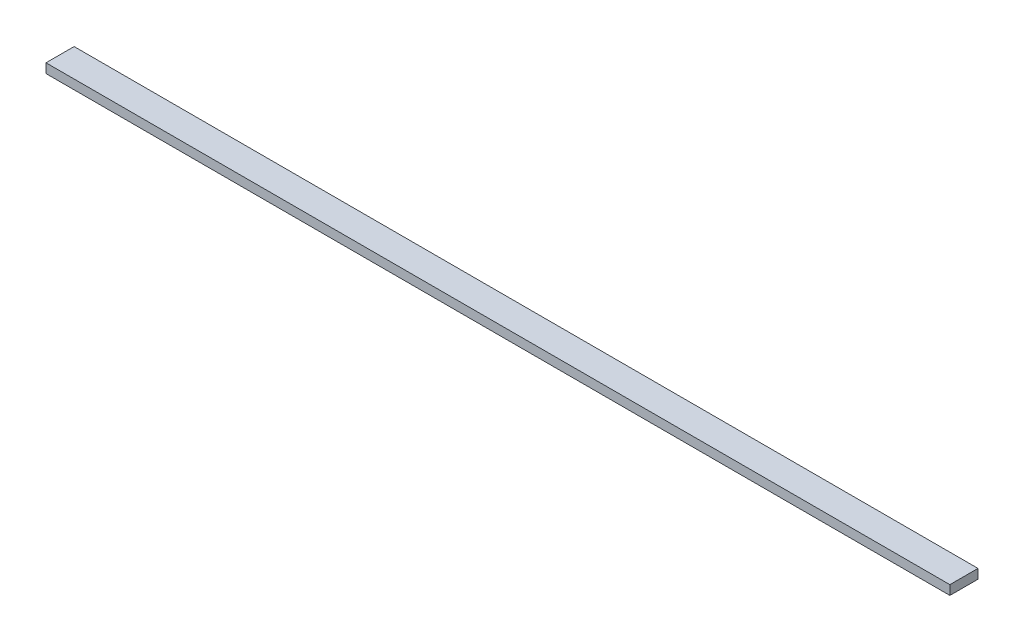
ISO-10303-21;
HEADER;
FILE_DESCRIPTION(('STEP AP214'),'2;1');
FILE_NAME('part.step','',(''),(''),'','','');
FILE_SCHEMA(('AUTOMOTIVE_DESIGN { 1 0 10303 214 1 1 1 1 }'));
ENDSEC;
DATA;
#1=APPLICATION_CONTEXT('core data for automotive mechanical design processes');
#2=APPLICATION_PROTOCOL_DEFINITION('international standard','automotive_design',2000,#1);
#3=PRODUCT_CONTEXT('',#1,'mechanical');
#4=PRODUCT('Part','Part','',(#3));
#5=PRODUCT_RELATED_PRODUCT_CATEGORY('part','',(#4));
#6=PRODUCT_DEFINITION_FORMATION('','',#4);
#7=PRODUCT_DEFINITION_CONTEXT('part definition',#1,'design');
#8=PRODUCT_DEFINITION('design','',#6,#7);
#9=PRODUCT_DEFINITION_SHAPE('','',#8);
#10=(LENGTH_UNIT() NAMED_UNIT(*) SI_UNIT(.MILLI.,.METRE.));
#11=(NAMED_UNIT(*) PLANE_ANGLE_UNIT() SI_UNIT($,.RADIAN.));
#12=(NAMED_UNIT(*) SI_UNIT($,.STERADIAN.) SOLID_ANGLE_UNIT());
#13=UNCERTAINTY_MEASURE_WITH_UNIT(LENGTH_MEASURE(1.E-05),#10,'distance_accuracy_value','');
#14=(GEOMETRIC_REPRESENTATION_CONTEXT(3) GLOBAL_UNCERTAINTY_ASSIGNED_CONTEXT((#13)) GLOBAL_UNIT_ASSIGNED_CONTEXT((#10,
#11,#12)) REPRESENTATION_CONTEXT('',''));
#15=CARTESIAN_POINT('',(0.,0.,0.));
#16=DIRECTION('',(0.,0.,1.));
#17=DIRECTION('',(1.,0.,0.));
#18=AXIS2_PLACEMENT_3D('',#15,#16,#17);
#19=CARTESIAN_POINT('',(306.13985,6.35,9.525));
#20=DIRECTION('',(-1.,0.,0.));
#21=DIRECTION('',(0.,0.,1.));
#22=AXIS2_PLACEMENT_3D('',#19,#20,#21);
#23=PLANE('',#22);
#24=DIRECTION('',(0.,0.,-1.));
#25=VECTOR('',#24,1.);
#26=CARTESIAN_POINT('',(306.13985,0.,9.525));
#27=LINE('',#26,#25);
#28=CARTESIAN_POINT('',(306.13985,0.,9.525));
#29=VERTEX_POINT('',#28);
#30=CARTESIAN_POINT('',(306.13985,0.,-9.525));
#31=VERTEX_POINT('',#30);
#32=EDGE_CURVE('E96',#29,#31,#27,.T.);
#33=ORIENTED_EDGE('',*,*,#32,.T.);
#34=DIRECTION('',(0.,-1.,0.));
#35=VECTOR('',#34,1.);
#36=CARTESIAN_POINT('',(306.13985,6.35,-9.525));
#37=LINE('',#36,#35);
#38=CARTESIAN_POINT('',(306.13985,6.35,-9.525));
#39=VERTEX_POINT('',#38);
#40=EDGE_CURVE('E11',#39,#31,#37,.T.);
#41=ORIENTED_EDGE('',*,*,#40,.F.);
#42=DIRECTION('',(0.,0.,-1.));
#43=VECTOR('',#42,1.);
#44=CARTESIAN_POINT('',(306.13985,6.35,9.525));
#45=LINE('',#44,#43);
#46=CARTESIAN_POINT('',(306.13985,6.35,9.525));
#47=VERTEX_POINT('',#46);
#48=EDGE_CURVE('E84',#47,#39,#45,.T.);
#49=ORIENTED_EDGE('',*,*,#48,.F.);
#50=DIRECTION('',(0.,-1.,0.));
#51=VECTOR('',#50,1.);
#52=CARTESIAN_POINT('',(306.13985,6.35,9.525));
#53=LINE('',#52,#51);
#54=EDGE_CURVE('E92',#47,#29,#53,.T.);
#55=ORIENTED_EDGE('',*,*,#54,.T.);
#56=EDGE_LOOP('',(#33,#41,#49,#55));
#57=FACE_BOUND('',#56,.T.);
#58=ADVANCED_FACE('F33',(#57),#23,.F.);
#59=CARTESIAN_POINT('',(-306.13985,6.35,-9.525));
#60=DIRECTION('',(0.,0.,1.));
#61=DIRECTION('',(1.,0.,0.));
#62=AXIS2_PLACEMENT_3D('',#59,#60,#61);
#63=PLANE('',#62);
#64=DIRECTION('',(-1.,0.,0.));
#65=VECTOR('',#64,1.);
#66=CARTESIAN_POINT('',(-306.13985,0.,-9.525));
#67=LINE('',#66,#65);
#68=CARTESIAN_POINT('',(-306.13985,0.,-9.525));
#69=VERTEX_POINT('',#68);
#70=EDGE_CURVE('E88',#31,#69,#67,.T.);
#71=ORIENTED_EDGE('',*,*,#70,.T.);
#72=DIRECTION('',(0.,-1.,0.));
#73=VECTOR('',#72,1.);
#74=CARTESIAN_POINT('',(-306.13985,6.35,-9.525));
#75=LINE('',#74,#73);
#76=CARTESIAN_POINT('',(-306.13985,6.35,-9.525));
#77=VERTEX_POINT('',#76);
#78=EDGE_CURVE('E41',#77,#69,#75,.T.);
#79=ORIENTED_EDGE('',*,*,#78,.F.);
#80=DIRECTION('',(-1.,0.,0.));
#81=VECTOR('',#80,1.);
#82=CARTESIAN_POINT('',(-306.13985,6.35,-9.525));
#83=LINE('',#82,#81);
#84=EDGE_CURVE('E79',#39,#77,#83,.T.);
#85=ORIENTED_EDGE('',*,*,#84,.F.);
#86=ORIENTED_EDGE('',*,*,#40,.T.);
#87=EDGE_LOOP('',(#71,#79,#85,#86));
#88=FACE_BOUND('',#87,.T.);
#89=ADVANCED_FACE('F87',(#88),#63,.F.);
#90=CARTESIAN_POINT('',(-306.13985,6.35,9.525));
#91=DIRECTION('',(1.,0.,0.));
#92=DIRECTION('',(0.,0.,-1.));
#93=AXIS2_PLACEMENT_3D('',#90,#91,#92);
#94=PLANE('',#93);
#95=DIRECTION('',(0.,0.,1.));
#96=VECTOR('',#95,1.);
#97=CARTESIAN_POINT('',(-306.13985,0.,9.525));
#98=LINE('',#97,#96);
#99=CARTESIAN_POINT('',(-306.13985,0.,9.525));
#100=VERTEX_POINT('',#99);
#101=EDGE_CURVE('E66',#69,#100,#98,.T.);
#102=ORIENTED_EDGE('',*,*,#101,.T.);
#103=DIRECTION('',(0.,-1.,0.));
#104=VECTOR('',#103,1.);
#105=CARTESIAN_POINT('',(-306.13985,6.35,9.525));
#106=LINE('',#105,#104);
#107=CARTESIAN_POINT('',(-306.13985,6.35,9.525));
#108=VERTEX_POINT('',#107);
#109=EDGE_CURVE('E89',#108,#100,#106,.T.);
#110=ORIENTED_EDGE('',*,*,#109,.F.);
#111=DIRECTION('',(0.,0.,1.));
#112=VECTOR('',#111,1.);
#113=CARTESIAN_POINT('',(-306.13985,6.35,9.525));
#114=LINE('',#113,#112);
#115=EDGE_CURVE('E82',#77,#108,#114,.T.);
#116=ORIENTED_EDGE('',*,*,#115,.F.);
#117=ORIENTED_EDGE('',*,*,#78,.T.);
#118=EDGE_LOOP('',(#102,#110,#116,#117));
#119=FACE_BOUND('',#118,.T.);
#120=ADVANCED_FACE('F90',(#119),#94,.F.);
#121=CARTESIAN_POINT('',(-306.13985,6.35,9.525));
#122=DIRECTION('',(0.,0.,-1.));
#123=DIRECTION('',(-1.,0.,0.));
#124=AXIS2_PLACEMENT_3D('',#121,#122,#123);
#125=PLANE('',#124);
#126=DIRECTION('',(1.,0.,0.));
#127=VECTOR('',#126,1.);
#128=CARTESIAN_POINT('',(-306.13985,0.,9.525));
#129=LINE('',#128,#127);
#130=EDGE_CURVE('E72',#100,#29,#129,.T.);
#131=ORIENTED_EDGE('',*,*,#130,.T.);
#132=ORIENTED_EDGE('',*,*,#54,.F.);
#133=DIRECTION('',(1.,0.,0.));
#134=VECTOR('',#133,1.);
#135=CARTESIAN_POINT('',(-306.13985,6.35,9.525));
#136=LINE('',#135,#134);
#137=EDGE_CURVE('E49',#108,#47,#136,.T.);
#138=ORIENTED_EDGE('',*,*,#137,.F.);
#139=ORIENTED_EDGE('',*,*,#109,.T.);
#140=EDGE_LOOP('',(#131,#132,#138,#139));
#141=FACE_BOUND('',#140,.T.);
#142=ADVANCED_FACE('F103',(#141),#125,.F.);
#143=CARTESIAN_POINT('',(0.,6.35,0.));
#144=DIRECTION('',(0.,-1.,0.));
#145=DIRECTION('',(0.,0.,-1.));
#146=AXIS2_PLACEMENT_3D('',#143,#144,#145);
#147=PLANE('',#146);
#148=ORIENTED_EDGE('',*,*,#48,.T.);
#149=ORIENTED_EDGE('',*,*,#84,.T.);
#150=ORIENTED_EDGE('',*,*,#115,.T.);
#151=ORIENTED_EDGE('',*,*,#137,.T.);
#152=EDGE_LOOP('',(#148,#149,#150,#151));
#153=FACE_BOUND('',#152,.T.);
#154=ADVANCED_FACE('F80',(#153),#147,.F.);
#155=CARTESIAN_POINT('',(0.,0.,0.));
#156=DIRECTION('',(0.,-1.,0.));
#157=DIRECTION('',(0.,0.,-1.));
#158=AXIS2_PLACEMENT_3D('',#155,#156,#157);
#159=PLANE('',#158);
#160=ORIENTED_EDGE('',*,*,#32,.F.);
#161=ORIENTED_EDGE('',*,*,#130,.F.);
#162=ORIENTED_EDGE('',*,*,#101,.F.);
#163=ORIENTED_EDGE('',*,*,#70,.F.);
#164=EDGE_LOOP('',(#160,#161,#162,#163));
#165=FACE_BOUND('',#164,.T.);
#166=ADVANCED_FACE('F106',(#165),#159,.T.);
#167=CLOSED_SHELL('',(#58,#89,#120,#142,#154,#166));
#168=MANIFOLD_SOLID_BREP('B2',#167);
#169=ADVANCED_BREP_SHAPE_REPRESENTATION('',(#18,#168),#14);
#170=SHAPE_DEFINITION_REPRESENTATION(#9,#169);
ENDSEC;
END-ISO-10303-21;
